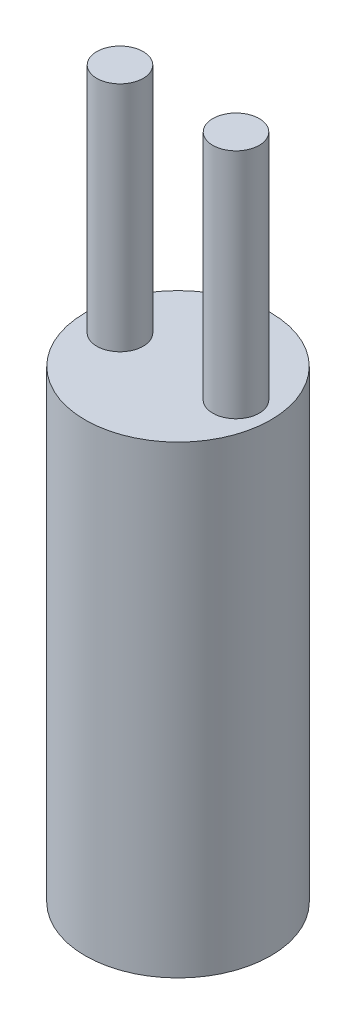
ISO-10303-21;
HEADER;
FILE_DESCRIPTION(('STEP AP214'),'2;1');
FILE_NAME('part.step','',(''),(''),'','','');
FILE_SCHEMA(('AUTOMOTIVE_DESIGN { 1 0 10303 214 1 1 1 1 }'));
ENDSEC;
DATA;
#1=APPLICATION_CONTEXT('core data for automotive mechanical design processes');
#2=APPLICATION_PROTOCOL_DEFINITION('international standard','automotive_design',2000,#1);
#3=PRODUCT_CONTEXT('',#1,'mechanical');
#4=PRODUCT('Part','Part','',(#3));
#5=PRODUCT_RELATED_PRODUCT_CATEGORY('part','',(#4));
#6=PRODUCT_DEFINITION_FORMATION('','',#4);
#7=PRODUCT_DEFINITION_CONTEXT('part definition',#1,'design');
#8=PRODUCT_DEFINITION('design','',#6,#7);
#9=PRODUCT_DEFINITION_SHAPE('','',#8);
#10=(LENGTH_UNIT() NAMED_UNIT(*) SI_UNIT(.MILLI.,.METRE.));
#11=(NAMED_UNIT(*) PLANE_ANGLE_UNIT() SI_UNIT($,.RADIAN.));
#12=(NAMED_UNIT(*) SI_UNIT($,.STERADIAN.) SOLID_ANGLE_UNIT());
#13=UNCERTAINTY_MEASURE_WITH_UNIT(LENGTH_MEASURE(1.E-05),#10,'distance_accuracy_value','');
#14=(GEOMETRIC_REPRESENTATION_CONTEXT(3) GLOBAL_UNCERTAINTY_ASSIGNED_CONTEXT((#13)) GLOBAL_UNIT_ASSIGNED_CONTEXT((#10,
#11,#12)) REPRESENTATION_CONTEXT('',''));
#15=CARTESIAN_POINT('',(0.,0.,0.));
#16=DIRECTION('',(0.,0.,1.));
#17=DIRECTION('',(1.,0.,0.));
#18=AXIS2_PLACEMENT_3D('',#15,#16,#17);
#19=CARTESIAN_POINT('',(0.,20.,0.));
#20=DIRECTION('',(0.,-1.,0.));
#21=DIRECTION('',(0.,0.,-1.));
#22=AXIS2_PLACEMENT_3D('',#19,#20,#21);
#23=CYLINDRICAL_SURFACE('',#22,4.);
#24=CARTESIAN_POINT('',(0.,20.,0.));
#25=DIRECTION('',(0.,1.,0.));
#26=DIRECTION('',(0.,0.,1.));
#27=AXIS2_PLACEMENT_3D('',#24,#25,#26);
#28=CIRCLE('',#27,4.);
#29=CARTESIAN_POINT('',(0.,20.,4.));
#30=VERTEX_POINT('',#29);
#31=EDGE_CURVE('E50',#30,#30,#28,.T.);
#32=ORIENTED_EDGE('',*,*,#31,.F.);
#33=EDGE_LOOP('',(#32));
#34=FACE_BOUND('',#33,.T.);
#35=CARTESIAN_POINT('',(0.,0.,0.));
#36=DIRECTION('',(0.,1.,0.));
#37=DIRECTION('',(0.,0.,1.));
#38=AXIS2_PLACEMENT_3D('',#35,#36,#37);
#39=CIRCLE('',#38,4.);
#40=CARTESIAN_POINT('',(0.,0.,4.));
#41=VERTEX_POINT('',#40);
#42=EDGE_CURVE('E55',#41,#41,#39,.T.);
#43=ORIENTED_EDGE('',*,*,#42,.T.);
#44=EDGE_LOOP('',(#43));
#45=FACE_BOUND('',#44,.T.);
#46=ADVANCED_FACE('F43',(#34,#45),#23,.T.);
#47=CARTESIAN_POINT('',(0.,20.,0.));
#48=DIRECTION('',(0.,1.,0.));
#49=DIRECTION('',(0.,0.,1.));
#50=AXIS2_PLACEMENT_3D('',#47,#48,#49);
#51=PLANE('',#50);
#52=CARTESIAN_POINT('',(2.5,20.,0.));
#53=DIRECTION('',(0.,1.,0.));
#54=DIRECTION('',(0.,0.,1.));
#55=AXIS2_PLACEMENT_3D('',#52,#53,#54);
#56=CIRCLE('',#55,1.);
#57=CARTESIAN_POINT('',(2.5,20.,1.));
#58=VERTEX_POINT('',#57);
#59=EDGE_CURVE('E10',#58,#58,#56,.T.);
#60=ORIENTED_EDGE('',*,*,#59,.F.);
#61=EDGE_LOOP('',(#60));
#62=FACE_BOUND('',#61,.T.);
#63=CARTESIAN_POINT('',(-2.5,20.,0.));
#64=DIRECTION('',(0.,1.,0.));
#65=DIRECTION('',(0.,0.,1.));
#66=AXIS2_PLACEMENT_3D('',#63,#64,#65);
#67=CIRCLE('',#66,1.);
#68=CARTESIAN_POINT('',(-2.5,20.,1.));
#69=VERTEX_POINT('',#68);
#70=EDGE_CURVE('E63',#69,#69,#67,.T.);
#71=ORIENTED_EDGE('',*,*,#70,.F.);
#72=EDGE_LOOP('',(#71));
#73=FACE_BOUND('',#72,.T.);
#74=ORIENTED_EDGE('',*,*,#31,.T.);
#75=EDGE_LOOP('',(#74));
#76=FACE_BOUND('',#75,.T.);
#77=ADVANCED_FACE('F86',(#62,#73,#76),#51,.T.);
#78=CARTESIAN_POINT('',(0.,0.,0.));
#79=DIRECTION('',(0.,1.,0.));
#80=DIRECTION('',(0.,0.,1.));
#81=AXIS2_PLACEMENT_3D('',#78,#79,#80);
#82=PLANE('',#81);
#83=ORIENTED_EDGE('',*,*,#42,.F.);
#84=EDGE_LOOP('',(#83));
#85=FACE_BOUND('',#84,.T.);
#86=ADVANCED_FACE('F92',(#85),#82,.F.);
#87=CARTESIAN_POINT('',(-2.5,30.,0.));
#88=DIRECTION('',(0.,-1.,0.));
#89=DIRECTION('',(0.,0.,-1.));
#90=AXIS2_PLACEMENT_3D('',#87,#88,#89);
#91=CYLINDRICAL_SURFACE('',#90,1.);
#92=CARTESIAN_POINT('',(-2.5,30.,0.));
#93=DIRECTION('',(0.,1.,0.));
#94=DIRECTION('',(0.,0.,1.));
#95=AXIS2_PLACEMENT_3D('',#92,#93,#94);
#96=CIRCLE('',#95,1.);
#97=CARTESIAN_POINT('',(-2.5,30.,1.));
#98=VERTEX_POINT('',#97);
#99=EDGE_CURVE('E61',#98,#98,#96,.T.);
#100=ORIENTED_EDGE('',*,*,#99,.F.);
#101=EDGE_LOOP('',(#100));
#102=FACE_BOUND('',#101,.T.);
#103=ORIENTED_EDGE('',*,*,#70,.T.);
#104=EDGE_LOOP('',(#103));
#105=FACE_BOUND('',#104,.T.);
#106=ADVANCED_FACE('F98',(#102,#105),#91,.T.);
#107=CARTESIAN_POINT('',(-2.5,30.,0.));
#108=DIRECTION('',(0.,1.,0.));
#109=DIRECTION('',(0.,0.,1.));
#110=AXIS2_PLACEMENT_3D('',#107,#108,#109);
#111=PLANE('',#110);
#112=ORIENTED_EDGE('',*,*,#99,.T.);
#113=EDGE_LOOP('',(#112));
#114=FACE_BOUND('',#113,.T.);
#115=ADVANCED_FACE('F83',(#114),#111,.T.);
#116=CARTESIAN_POINT('',(2.5,30.,0.));
#117=DIRECTION('',(0.,-1.,0.));
#118=DIRECTION('',(0.,0.,-1.));
#119=AXIS2_PLACEMENT_3D('',#116,#117,#118);
#120=CYLINDRICAL_SURFACE('',#119,1.);
#121=CARTESIAN_POINT('',(2.5,30.,0.));
#122=DIRECTION('',(0.,-1.,0.));
#123=DIRECTION('',(0.,0.,1.));
#124=AXIS2_PLACEMENT_3D('',#121,#122,#123);
#125=CIRCLE('',#124,1.);
#126=CARTESIAN_POINT('',(2.5,30.,1.));
#127=VERTEX_POINT('',#126);
#128=EDGE_CURVE('E67',#127,#127,#125,.T.);
#129=ORIENTED_EDGE('',*,*,#128,.T.);
#130=EDGE_LOOP('',(#129));
#131=FACE_BOUND('',#130,.T.);
#132=ORIENTED_EDGE('',*,*,#59,.T.);
#133=EDGE_LOOP('',(#132));
#134=FACE_BOUND('',#133,.T.);
#135=ADVANCED_FACE('F75',(#131,#134),#120,.T.);
#136=CARTESIAN_POINT('',(2.5,30.,0.));
#137=DIRECTION('',(0.,1.,0.));
#138=DIRECTION('',(0.,0.,1.));
#139=AXIS2_PLACEMENT_3D('',#136,#137,#138);
#140=PLANE('',#139);
#141=ORIENTED_EDGE('',*,*,#128,.F.);
#142=EDGE_LOOP('',(#141));
#143=FACE_BOUND('',#142,.T.);
#144=ADVANCED_FACE('F77',(#143),#140,.T.);
#145=CLOSED_SHELL('',(#46,#77,#86,#106,#115,#135,#144));
#146=MANIFOLD_SOLID_BREP('B2',#145);
#147=ADVANCED_BREP_SHAPE_REPRESENTATION('',(#18,#146),#14);
#148=SHAPE_DEFINITION_REPRESENTATION(#9,#147);
ENDSEC;
END-ISO-10303-21;
